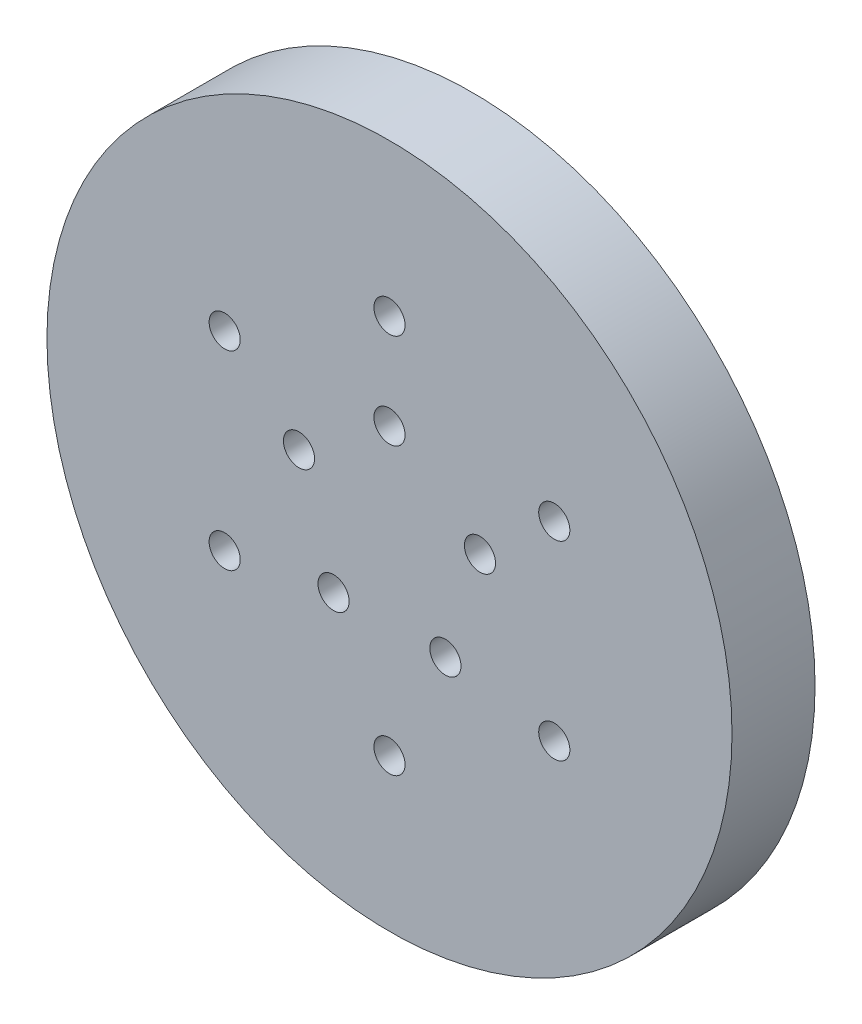
ISO-10303-21;
HEADER;
FILE_DESCRIPTION(('STEP AP214'),'2;1');
FILE_NAME('part.step','',(''),(''),'','','');
FILE_SCHEMA(('AUTOMOTIVE_DESIGN { 1 0 10303 214 1 1 1 1 }'));
ENDSEC;
DATA;
#1=APPLICATION_CONTEXT('core data for automotive mechanical design processes');
#2=APPLICATION_PROTOCOL_DEFINITION('international standard','automotive_design',2000,#1);
#3=PRODUCT_CONTEXT('',#1,'mechanical');
#4=PRODUCT('Part','Part','',(#3));
#5=PRODUCT_RELATED_PRODUCT_CATEGORY('part','',(#4));
#6=PRODUCT_DEFINITION_FORMATION('','',#4);
#7=PRODUCT_DEFINITION_CONTEXT('part definition',#1,'design');
#8=PRODUCT_DEFINITION('design','',#6,#7);
#9=PRODUCT_DEFINITION_SHAPE('','',#8);
#10=(LENGTH_UNIT() NAMED_UNIT(*) SI_UNIT(.MILLI.,.METRE.));
#11=(NAMED_UNIT(*) PLANE_ANGLE_UNIT() SI_UNIT($,.RADIAN.));
#12=(NAMED_UNIT(*) SI_UNIT($,.STERADIAN.) SOLID_ANGLE_UNIT());
#13=UNCERTAINTY_MEASURE_WITH_UNIT(LENGTH_MEASURE(1.E-05),#10,'distance_accuracy_value','');
#14=(GEOMETRIC_REPRESENTATION_CONTEXT(3) GLOBAL_UNCERTAINTY_ASSIGNED_CONTEXT((#13)) GLOBAL_UNIT_ASSIGNED_CONTEXT((#10,
#11,#12)) REPRESENTATION_CONTEXT('',''));
#15=CARTESIAN_POINT('',(0.,0.,0.));
#16=DIRECTION('',(0.,0.,1.));
#17=DIRECTION('',(1.,0.,0.));
#18=AXIS2_PLACEMENT_3D('',#15,#16,#17);
#19=CARTESIAN_POINT('',(0.,0.,4.));
#20=DIRECTION('',(0.,0.,-1.));
#21=DIRECTION('',(-1.,0.,0.));
#22=AXIS2_PLACEMENT_3D('',#19,#20,#21);
#23=CYLINDRICAL_SURFACE('',#22,16.5);
#24=CARTESIAN_POINT('',(0.,0.,4.));
#25=DIRECTION('',(0.,0.,1.));
#26=DIRECTION('',(1.,0.,0.));
#27=AXIS2_PLACEMENT_3D('',#24,#25,#26);
#28=CIRCLE('',#27,16.5);
#29=CARTESIAN_POINT('',(16.5,0.,4.));
#30=VERTEX_POINT('',#29);
#31=EDGE_CURVE('E10',#30,#30,#28,.T.);
#32=ORIENTED_EDGE('',*,*,#31,.F.);
#33=EDGE_LOOP('',(#32));
#34=FACE_BOUND('',#33,.T.);
#35=CARTESIAN_POINT('',(0.,0.,0.));
#36=DIRECTION('',(0.,0.,1.));
#37=DIRECTION('',(1.,0.,0.));
#38=AXIS2_PLACEMENT_3D('',#35,#36,#37);
#39=CIRCLE('',#38,16.5);
#40=CARTESIAN_POINT('',(16.5,0.,0.));
#41=VERTEX_POINT('',#40);
#42=EDGE_CURVE('E33',#41,#41,#39,.T.);
#43=ORIENTED_EDGE('',*,*,#42,.T.);
#44=EDGE_LOOP('',(#43));
#45=FACE_BOUND('',#44,.T.);
#46=ADVANCED_FACE('F30',(#34,#45),#23,.T.);
#47=CARTESIAN_POINT('',(0.,0.,4.));
#48=DIRECTION('',(0.,0.,1.));
#49=DIRECTION('',(1.,0.,0.));
#50=AXIS2_PLACEMENT_3D('',#47,#48,#49);
#51=PLANE('',#50);
#52=CARTESIAN_POINT('',(0.,9.1664484035212,4.));
#53=DIRECTION('',(0.,0.,1.));
#54=DIRECTION('',(1.,0.,0.));
#55=AXIS2_PLACEMENT_3D('',#52,#53,#54);
#56=CIRCLE('',#55,0.75);
#57=CARTESIAN_POINT('',(0.75,9.1664484035212,4.));
#58=VERTEX_POINT('',#57);
#59=EDGE_CURVE('E67',#58,#58,#56,.T.);
#60=ORIENTED_EDGE('',*,*,#59,.F.);
#61=EDGE_LOOP('',(#60));
#62=FACE_BOUND('',#61,.T.);
#63=CARTESIAN_POINT('',(-4.35890524272572,1.41629416737432,4.));
#64=DIRECTION('',(0.,0.,1.));
#65=DIRECTION('',(1.,0.,0.));
#66=AXIS2_PLACEMENT_3D('',#63,#64,#65);
#67=CIRCLE('',#66,0.750000000000233);
#68=CARTESIAN_POINT('',(-3.60890524272549,1.41629416737432,4.));
#69=VERTEX_POINT('',#68);
#70=EDGE_CURVE('E92',#69,#69,#67,.T.);
#71=ORIENTED_EDGE('',*,*,#70,.F.);
#72=EDGE_LOOP('',(#71));
#73=FACE_BOUND('',#72,.T.);
#74=CARTESIAN_POINT('',(-2.69395159374434,-3.70790626825481,4.));
#75=DIRECTION('',(0.,0.,1.));
#76=DIRECTION('',(1.,0.,0.));
#77=AXIS2_PLACEMENT_3D('',#74,#75,#76);
#78=CIRCLE('',#77,0.750000000000409);
#79=CARTESIAN_POINT('',(-1.94395159374393,-3.70790626825481,4.));
#80=VERTEX_POINT('',#79);
#81=EDGE_CURVE('E98',#80,#80,#78,.T.);
#82=ORIENTED_EDGE('',*,*,#81,.F.);
#83=EDGE_LOOP('',(#82));
#84=FACE_BOUND('',#83,.T.);
#85=CARTESIAN_POINT('',(0.,4.58322420176037,4.));
#86=DIRECTION('',(0.,0.,1.));
#87=DIRECTION('',(1.,0.,0.));
#88=AXIS2_PLACEMENT_3D('',#85,#86,#87);
#89=CIRCLE('',#88,0.75);
#90=CARTESIAN_POINT('',(0.75,4.58322420176037,4.));
#91=VERTEX_POINT('',#90);
#92=EDGE_CURVE('E61',#91,#91,#89,.T.);
#93=ORIENTED_EDGE('',*,*,#92,.F.);
#94=EDGE_LOOP('',(#93));
#95=FACE_BOUND('',#94,.T.);
#96=CARTESIAN_POINT('',(7.9383771799288,4.58322420176083,4.));
#97=DIRECTION('',(0.,0.,1.));
#98=DIRECTION('',(1.,0.,0.));
#99=AXIS2_PLACEMENT_3D('',#96,#97,#98);
#100=CIRCLE('',#99,0.750000000000082);
#101=CARTESIAN_POINT('',(8.68837717992888,4.58322420176083,4.));
#102=VERTEX_POINT('',#101);
#103=EDGE_CURVE('E55',#102,#102,#100,.T.);
#104=ORIENTED_EDGE('',*,*,#103,.F.);
#105=EDGE_LOOP('',(#104));
#106=FACE_BOUND('',#105,.T.);
#107=CARTESIAN_POINT('',(7.93837717992906,-4.58322420176037,4.));
#108=DIRECTION('',(0.,0.,1.));
#109=DIRECTION('',(1.,0.,0.));
#110=AXIS2_PLACEMENT_3D('',#107,#108,#109);
#111=CIRCLE('',#110,0.750000000000349);
#112=CARTESIAN_POINT('',(8.68837717992941,-4.58322420176037,4.));
#113=VERTEX_POINT('',#112);
#114=EDGE_CURVE('E49',#113,#113,#111,.T.);
#115=ORIENTED_EDGE('',*,*,#114,.F.);
#116=EDGE_LOOP('',(#115));
#117=FACE_BOUND('',#116,.T.);
#118=CARTESIAN_POINT('',(5.18807133727956E-13,-9.1664484035212,4.));
#119=DIRECTION('',(0.,0.,1.));
#120=DIRECTION('',(1.,0.,0.));
#121=AXIS2_PLACEMENT_3D('',#118,#119,#120);
#122=CIRCLE('',#121,0.750000000000558);
#123=CARTESIAN_POINT('',(0.750000000001076,-9.1664484035212,4.));
#124=VERTEX_POINT('',#123);
#125=EDGE_CURVE('E42',#124,#124,#122,.T.);
#126=ORIENTED_EDGE('',*,*,#125,.F.);
#127=EDGE_LOOP('',(#126));
#128=FACE_BOUND('',#127,.T.);
#129=CARTESIAN_POINT('',(-7.93837717992828,-4.58322420176083,4.));
#130=DIRECTION('',(0.,0.,1.));
#131=DIRECTION('',(1.,0.,0.));
#132=AXIS2_PLACEMENT_3D('',#129,#130,#131);
#133=CIRCLE('',#132,0.750000000000523);
#134=CARTESIAN_POINT('',(-7.18837717992776,-4.58322420176083,4.));
#135=VERTEX_POINT('',#134);
#136=EDGE_CURVE('E87',#135,#135,#133,.T.);
#137=ORIENTED_EDGE('',*,*,#136,.F.);
#138=EDGE_LOOP('',(#137));
#139=FACE_BOUND('',#138,.T.);
#140=CARTESIAN_POINT('',(-7.93837717992854,4.58322420176037,4.));
#141=DIRECTION('',(0.,0.,1.));
#142=DIRECTION('',(1.,0.,0.));
#143=AXIS2_PLACEMENT_3D('',#140,#141,#142);
#144=CIRCLE('',#143,0.750000000000299);
#145=CARTESIAN_POINT('',(-7.18837717992824,4.58322420176037,4.));
#146=VERTEX_POINT('',#145);
#147=EDGE_CURVE('E81',#146,#146,#144,.T.);
#148=ORIENTED_EDGE('',*,*,#147,.F.);
#149=EDGE_LOOP('',(#148));
#150=FACE_BOUND('',#149,.T.);
#151=CARTESIAN_POINT('',(4.35890524272599,1.41629416737469,4.));
#152=DIRECTION('',(0.,0.,1.));
#153=DIRECTION('',(1.,0.,0.));
#154=AXIS2_PLACEMENT_3D('',#151,#152,#153);
#155=CIRCLE('',#154,0.750000000000088);
#156=CARTESIAN_POINT('',(5.10890524272608,1.41629416737469,4.));
#157=VERTEX_POINT('',#156);
#158=EDGE_CURVE('E75',#157,#157,#155,.T.);
#159=ORIENTED_EDGE('',*,*,#158,.F.);
#160=EDGE_LOOP('',(#159));
#161=FACE_BOUND('',#160,.T.);
#162=CARTESIAN_POINT('',(2.69395159374504,-3.70790626825458,4.));
#163=DIRECTION('',(0.,0.,1.));
#164=DIRECTION('',(1.,0.,0.));
#165=AXIS2_PLACEMENT_3D('',#162,#163,#164);
#166=CIRCLE('',#165,0.750000000000329);
#167=CARTESIAN_POINT('',(3.44395159374537,-3.70790626825458,4.));
#168=VERTEX_POINT('',#167);
#169=EDGE_CURVE('E68',#168,#168,#166,.T.);
#170=ORIENTED_EDGE('',*,*,#169,.F.);
#171=EDGE_LOOP('',(#170));
#172=FACE_BOUND('',#171,.T.);
#173=ORIENTED_EDGE('',*,*,#31,.T.);
#174=EDGE_LOOP('',(#173));
#175=FACE_BOUND('',#174,.T.);
#176=ADVANCED_FACE('F118',(#62,#73,#84,#95,#106,#117,#128,#139,#150,#161,#172,#175),#51,.T.);
#177=CARTESIAN_POINT('',(0.,0.,0.));
#178=DIRECTION('',(0.,0.,1.));
#179=DIRECTION('',(1.,0.,0.));
#180=AXIS2_PLACEMENT_3D('',#177,#178,#179);
#181=PLANE('',#180);
#182=CARTESIAN_POINT('',(0.,9.1664484035212,0.));
#183=DIRECTION('',(0.,0.,1.));
#184=DIRECTION('',(1.,0.,0.));
#185=AXIS2_PLACEMENT_3D('',#182,#183,#184);
#186=CIRCLE('',#185,0.75);
#187=CARTESIAN_POINT('',(0.75,9.1664484035212,0.));
#188=VERTEX_POINT('',#187);
#189=EDGE_CURVE('E40',#188,#188,#186,.T.);
#190=ORIENTED_EDGE('',*,*,#189,.T.);
#191=EDGE_LOOP('',(#190));
#192=FACE_BOUND('',#191,.T.);
#193=CARTESIAN_POINT('',(-4.35890524272572,1.41629416737432,0.));
#194=DIRECTION('',(0.,0.,1.));
#195=DIRECTION('',(1.,0.,0.));
#196=AXIS2_PLACEMENT_3D('',#193,#194,#195);
#197=CIRCLE('',#196,0.750000000000233);
#198=CARTESIAN_POINT('',(-3.60890524272549,1.41629416737432,0.));
#199=VERTEX_POINT('',#198);
#200=EDGE_CURVE('E95',#199,#199,#197,.T.);
#201=ORIENTED_EDGE('',*,*,#200,.T.);
#202=EDGE_LOOP('',(#201));
#203=FACE_BOUND('',#202,.T.);
#204=CARTESIAN_POINT('',(-2.69395159374434,-3.70790626825481,0.));
#205=DIRECTION('',(0.,0.,1.));
#206=DIRECTION('',(1.,0.,0.));
#207=AXIS2_PLACEMENT_3D('',#204,#205,#206);
#208=CIRCLE('',#207,0.750000000000409);
#209=CARTESIAN_POINT('',(-1.94395159374393,-3.70790626825481,0.));
#210=VERTEX_POINT('',#209);
#211=EDGE_CURVE('E72',#210,#210,#208,.T.);
#212=ORIENTED_EDGE('',*,*,#211,.T.);
#213=EDGE_LOOP('',(#212));
#214=FACE_BOUND('',#213,.T.);
#215=CARTESIAN_POINT('',(0.,4.58322420176037,0.));
#216=DIRECTION('',(0.,0.,1.));
#217=DIRECTION('',(1.,0.,0.));
#218=AXIS2_PLACEMENT_3D('',#215,#216,#217);
#219=CIRCLE('',#218,0.75);
#220=CARTESIAN_POINT('',(0.75,4.58322420176037,0.));
#221=VERTEX_POINT('',#220);
#222=EDGE_CURVE('E64',#221,#221,#219,.T.);
#223=ORIENTED_EDGE('',*,*,#222,.T.);
#224=EDGE_LOOP('',(#223));
#225=FACE_BOUND('',#224,.T.);
#226=CARTESIAN_POINT('',(7.9383771799288,4.58322420176083,0.));
#227=DIRECTION('',(0.,0.,1.));
#228=DIRECTION('',(1.,0.,0.));
#229=AXIS2_PLACEMENT_3D('',#226,#227,#228);
#230=CIRCLE('',#229,0.750000000000082);
#231=CARTESIAN_POINT('',(8.68837717992888,4.58322420176083,0.));
#232=VERTEX_POINT('',#231);
#233=EDGE_CURVE('E58',#232,#232,#230,.T.);
#234=ORIENTED_EDGE('',*,*,#233,.T.);
#235=EDGE_LOOP('',(#234));
#236=FACE_BOUND('',#235,.T.);
#237=CARTESIAN_POINT('',(7.93837717992906,-4.58322420176037,0.));
#238=DIRECTION('',(0.,0.,1.));
#239=DIRECTION('',(1.,0.,0.));
#240=AXIS2_PLACEMENT_3D('',#237,#238,#239);
#241=CIRCLE('',#240,0.750000000000349);
#242=CARTESIAN_POINT('',(8.68837717992941,-4.58322420176037,0.));
#243=VERTEX_POINT('',#242);
#244=EDGE_CURVE('E52',#243,#243,#241,.T.);
#245=ORIENTED_EDGE('',*,*,#244,.T.);
#246=EDGE_LOOP('',(#245));
#247=FACE_BOUND('',#246,.T.);
#248=CARTESIAN_POINT('',(5.18807133727956E-13,-9.1664484035212,0.));
#249=DIRECTION('',(0.,0.,1.));
#250=DIRECTION('',(1.,0.,0.));
#251=AXIS2_PLACEMENT_3D('',#248,#249,#250);
#252=CIRCLE('',#251,0.750000000000558);
#253=CARTESIAN_POINT('',(0.750000000001076,-9.1664484035212,0.));
#254=VERTEX_POINT('',#253);
#255=EDGE_CURVE('E45',#254,#254,#252,.T.);
#256=ORIENTED_EDGE('',*,*,#255,.T.);
#257=EDGE_LOOP('',(#256));
#258=FACE_BOUND('',#257,.T.);
#259=CARTESIAN_POINT('',(-7.93837717992828,-4.58322420176083,0.));
#260=DIRECTION('',(0.,0.,1.));
#261=DIRECTION('',(1.,0.,0.));
#262=AXIS2_PLACEMENT_3D('',#259,#260,#261);
#263=CIRCLE('',#262,0.750000000000523);
#264=CARTESIAN_POINT('',(-7.18837717992776,-4.58322420176083,0.));
#265=VERTEX_POINT('',#264);
#266=EDGE_CURVE('E46',#265,#265,#263,.T.);
#267=ORIENTED_EDGE('',*,*,#266,.T.);
#268=EDGE_LOOP('',(#267));
#269=FACE_BOUND('',#268,.T.);
#270=CARTESIAN_POINT('',(-7.93837717992854,4.58322420176037,0.));
#271=DIRECTION('',(0.,0.,1.));
#272=DIRECTION('',(1.,0.,0.));
#273=AXIS2_PLACEMENT_3D('',#270,#271,#272);
#274=CIRCLE('',#273,0.750000000000299);
#275=CARTESIAN_POINT('',(-7.18837717992824,4.58322420176037,0.));
#276=VERTEX_POINT('',#275);
#277=EDGE_CURVE('E84',#276,#276,#274,.T.);
#278=ORIENTED_EDGE('',*,*,#277,.T.);
#279=EDGE_LOOP('',(#278));
#280=FACE_BOUND('',#279,.T.);
#281=CARTESIAN_POINT('',(4.35890524272599,1.41629416737469,0.));
#282=DIRECTION('',(0.,0.,1.));
#283=DIRECTION('',(1.,0.,0.));
#284=AXIS2_PLACEMENT_3D('',#281,#282,#283);
#285=CIRCLE('',#284,0.750000000000088);
#286=CARTESIAN_POINT('',(5.10890524272608,1.41629416737469,0.));
#287=VERTEX_POINT('',#286);
#288=EDGE_CURVE('E78',#287,#287,#285,.T.);
#289=ORIENTED_EDGE('',*,*,#288,.T.);
#290=EDGE_LOOP('',(#289));
#291=FACE_BOUND('',#290,.T.);
#292=CARTESIAN_POINT('',(2.69395159374504,-3.70790626825458,0.));
#293=DIRECTION('',(0.,0.,1.));
#294=DIRECTION('',(1.,0.,0.));
#295=AXIS2_PLACEMENT_3D('',#292,#293,#294);
#296=CIRCLE('',#295,0.750000000000329);
#297=CARTESIAN_POINT('',(3.44395159374537,-3.70790626825458,0.));
#298=VERTEX_POINT('',#297);
#299=EDGE_CURVE('E71',#298,#298,#296,.T.);
#300=ORIENTED_EDGE('',*,*,#299,.T.);
#301=EDGE_LOOP('',(#300));
#302=FACE_BOUND('',#301,.T.);
#303=ORIENTED_EDGE('',*,*,#42,.F.);
#304=EDGE_LOOP('',(#303));
#305=FACE_BOUND('',#304,.T.);
#306=ADVANCED_FACE('F108',(#192,#203,#214,#225,#236,#247,#258,#269,#280,#291,#302,#305),#181,.F.);
#307=CARTESIAN_POINT('',(2.69395159374504,-3.70790626825458,0.));
#308=DIRECTION('',(0.,0.,1.));
#309=DIRECTION('',(1.,0.,0.));
#310=AXIS2_PLACEMENT_3D('',#307,#308,#309);
#311=CYLINDRICAL_SURFACE('',#310,0.750000000000329);
#312=ORIENTED_EDGE('',*,*,#299,.F.);
#313=EDGE_LOOP('',(#312));
#314=FACE_BOUND('',#313,.T.);
#315=ORIENTED_EDGE('',*,*,#169,.T.);
#316=EDGE_LOOP('',(#315));
#317=FACE_BOUND('',#316,.T.);
#318=ADVANCED_FACE('F142',(#314,#317),#311,.F.);
#319=CARTESIAN_POINT('',(4.35890524272599,1.41629416737469,0.));
#320=DIRECTION('',(0.,0.,1.));
#321=DIRECTION('',(1.,0.,0.));
#322=AXIS2_PLACEMENT_3D('',#319,#320,#321);
#323=CYLINDRICAL_SURFACE('',#322,0.750000000000088);
#324=ORIENTED_EDGE('',*,*,#288,.F.);
#325=EDGE_LOOP('',(#324));
#326=FACE_BOUND('',#325,.T.);
#327=ORIENTED_EDGE('',*,*,#158,.T.);
#328=EDGE_LOOP('',(#327));
#329=FACE_BOUND('',#328,.T.);
#330=ADVANCED_FACE('F144',(#326,#329),#323,.F.);
#331=CARTESIAN_POINT('',(-7.93837717992854,4.58322420176037,0.));
#332=DIRECTION('',(0.,0.,1.));
#333=DIRECTION('',(1.,0.,0.));
#334=AXIS2_PLACEMENT_3D('',#331,#332,#333);
#335=CYLINDRICAL_SURFACE('',#334,0.750000000000299);
#336=ORIENTED_EDGE('',*,*,#277,.F.);
#337=EDGE_LOOP('',(#336));
#338=FACE_BOUND('',#337,.T.);
#339=ORIENTED_EDGE('',*,*,#147,.T.);
#340=EDGE_LOOP('',(#339));
#341=FACE_BOUND('',#340,.T.);
#342=ADVANCED_FACE('F151',(#338,#341),#335,.F.);
#343=CARTESIAN_POINT('',(-7.93837717992828,-4.58322420176083,0.));
#344=DIRECTION('',(0.,0.,1.));
#345=DIRECTION('',(1.,0.,0.));
#346=AXIS2_PLACEMENT_3D('',#343,#344,#345);
#347=CYLINDRICAL_SURFACE('',#346,0.750000000000523);
#348=ORIENTED_EDGE('',*,*,#266,.F.);
#349=EDGE_LOOP('',(#348));
#350=FACE_BOUND('',#349,.T.);
#351=ORIENTED_EDGE('',*,*,#136,.T.);
#352=EDGE_LOOP('',(#351));
#353=FACE_BOUND('',#352,.T.);
#354=ADVANCED_FACE('F190',(#350,#353),#347,.F.);
#355=CARTESIAN_POINT('',(5.18807133727956E-13,-9.1664484035212,0.));
#356=DIRECTION('',(0.,0.,1.));
#357=DIRECTION('',(1.,0.,0.));
#358=AXIS2_PLACEMENT_3D('',#355,#356,#357);
#359=CYLINDRICAL_SURFACE('',#358,0.750000000000558);
#360=ORIENTED_EDGE('',*,*,#255,.F.);
#361=EDGE_LOOP('',(#360));
#362=FACE_BOUND('',#361,.T.);
#363=ORIENTED_EDGE('',*,*,#125,.T.);
#364=EDGE_LOOP('',(#363));
#365=FACE_BOUND('',#364,.T.);
#366=ADVANCED_FACE('F200',(#362,#365),#359,.F.);
#367=CARTESIAN_POINT('',(7.93837717992906,-4.58322420176037,0.));
#368=DIRECTION('',(0.,0.,1.));
#369=DIRECTION('',(1.,0.,0.));
#370=AXIS2_PLACEMENT_3D('',#367,#368,#369);
#371=CYLINDRICAL_SURFACE('',#370,0.750000000000349);
#372=ORIENTED_EDGE('',*,*,#244,.F.);
#373=EDGE_LOOP('',(#372));
#374=FACE_BOUND('',#373,.T.);
#375=ORIENTED_EDGE('',*,*,#114,.T.);
#376=EDGE_LOOP('',(#375));
#377=FACE_BOUND('',#376,.T.);
#378=ADVANCED_FACE('F210',(#374,#377),#371,.F.);
#379=CARTESIAN_POINT('',(7.9383771799288,4.58322420176083,0.));
#380=DIRECTION('',(0.,0.,1.));
#381=DIRECTION('',(1.,0.,0.));
#382=AXIS2_PLACEMENT_3D('',#379,#380,#381);
#383=CYLINDRICAL_SURFACE('',#382,0.750000000000082);
#384=ORIENTED_EDGE('',*,*,#233,.F.);
#385=EDGE_LOOP('',(#384));
#386=FACE_BOUND('',#385,.T.);
#387=ORIENTED_EDGE('',*,*,#103,.T.);
#388=EDGE_LOOP('',(#387));
#389=FACE_BOUND('',#388,.T.);
#390=ADVANCED_FACE('F220',(#386,#389),#383,.F.);
#391=CARTESIAN_POINT('',(0.,4.58322420176037,0.));
#392=DIRECTION('',(0.,0.,1.));
#393=DIRECTION('',(1.,0.,0.));
#394=AXIS2_PLACEMENT_3D('',#391,#392,#393);
#395=CYLINDRICAL_SURFACE('',#394,0.75);
#396=ORIENTED_EDGE('',*,*,#222,.F.);
#397=EDGE_LOOP('',(#396));
#398=FACE_BOUND('',#397,.T.);
#399=ORIENTED_EDGE('',*,*,#92,.T.);
#400=EDGE_LOOP('',(#399));
#401=FACE_BOUND('',#400,.T.);
#402=ADVANCED_FACE('F230',(#398,#401),#395,.F.);
#403=CARTESIAN_POINT('',(-2.69395159374434,-3.70790626825481,0.));
#404=DIRECTION('',(0.,0.,1.));
#405=DIRECTION('',(1.,0.,0.));
#406=AXIS2_PLACEMENT_3D('',#403,#404,#405);
#407=CYLINDRICAL_SURFACE('',#406,0.750000000000409);
#408=ORIENTED_EDGE('',*,*,#211,.F.);
#409=EDGE_LOOP('',(#408));
#410=FACE_BOUND('',#409,.T.);
#411=ORIENTED_EDGE('',*,*,#81,.T.);
#412=EDGE_LOOP('',(#411));
#413=FACE_BOUND('',#412,.T.);
#414=ADVANCED_FACE('F240',(#410,#413),#407,.F.);
#415=CARTESIAN_POINT('',(-4.35890524272572,1.41629416737432,0.));
#416=DIRECTION('',(0.,0.,1.));
#417=DIRECTION('',(1.,0.,0.));
#418=AXIS2_PLACEMENT_3D('',#415,#416,#417);
#419=CYLINDRICAL_SURFACE('',#418,0.750000000000233);
#420=ORIENTED_EDGE('',*,*,#200,.F.);
#421=EDGE_LOOP('',(#420));
#422=FACE_BOUND('',#421,.T.);
#423=ORIENTED_EDGE('',*,*,#70,.T.);
#424=EDGE_LOOP('',(#423));
#425=FACE_BOUND('',#424,.T.);
#426=ADVANCED_FACE('F114',(#422,#425),#419,.F.);
#427=CARTESIAN_POINT('',(0.,9.1664484035212,0.));
#428=DIRECTION('',(0.,0.,1.));
#429=DIRECTION('',(1.,0.,0.));
#430=AXIS2_PLACEMENT_3D('',#427,#428,#429);
#431=CYLINDRICAL_SURFACE('',#430,0.75);
#432=ORIENTED_EDGE('',*,*,#189,.F.);
#433=EDGE_LOOP('',(#432));
#434=FACE_BOUND('',#433,.T.);
#435=ORIENTED_EDGE('',*,*,#59,.T.);
#436=EDGE_LOOP('',(#435));
#437=FACE_BOUND('',#436,.T.);
#438=ADVANCED_FACE('F111',(#434,#437),#431,.F.);
#439=CLOSED_SHELL('',(#46,#176,#306,#318,#330,#342,#354,#366,#378,#390,#402,#414,#426,#438));
#440=MANIFOLD_SOLID_BREP('B2',#439);
#441=ADVANCED_BREP_SHAPE_REPRESENTATION('',(#18,#440),#14);
#442=SHAPE_DEFINITION_REPRESENTATION(#9,#441);
ENDSEC;
END-ISO-10303-21;
